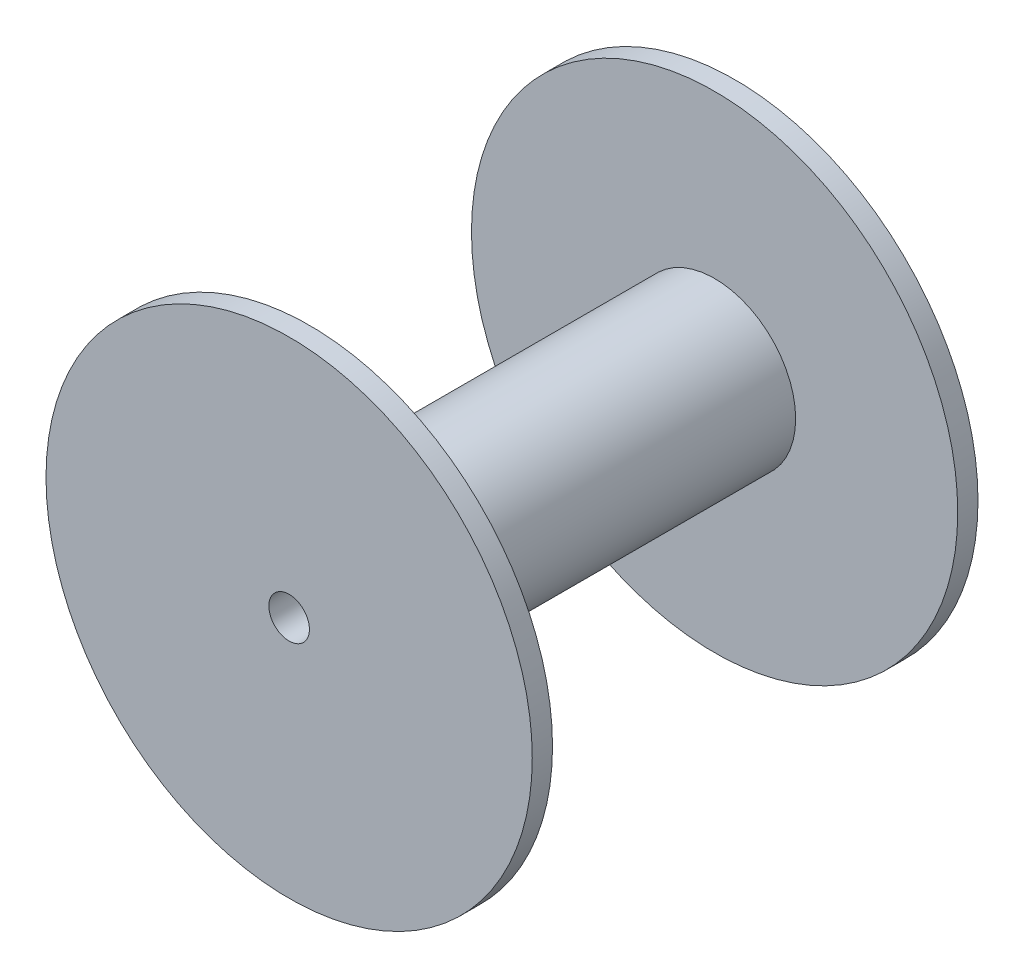
ISO-10303-21;
HEADER;
FILE_DESCRIPTION(('STEP AP214'),'2;1');
FILE_NAME('part.step','',(''),(''),'','','');
FILE_SCHEMA(('AUTOMOTIVE_DESIGN { 1 0 10303 214 1 1 1 1 }'));
ENDSEC;
DATA;
#1=APPLICATION_CONTEXT('core data for automotive mechanical design processes');
#2=APPLICATION_PROTOCOL_DEFINITION('international standard','automotive_design',2000,#1);
#3=PRODUCT_CONTEXT('',#1,'mechanical');
#4=PRODUCT('Part','Part','',(#3));
#5=PRODUCT_RELATED_PRODUCT_CATEGORY('part','',(#4));
#6=PRODUCT_DEFINITION_FORMATION('','',#4);
#7=PRODUCT_DEFINITION_CONTEXT('part definition',#1,'design');
#8=PRODUCT_DEFINITION('design','',#6,#7);
#9=PRODUCT_DEFINITION_SHAPE('','',#8);
#10=(LENGTH_UNIT() NAMED_UNIT(*) SI_UNIT(.MILLI.,.METRE.));
#11=(NAMED_UNIT(*) PLANE_ANGLE_UNIT() SI_UNIT($,.RADIAN.));
#12=(NAMED_UNIT(*) SI_UNIT($,.STERADIAN.) SOLID_ANGLE_UNIT());
#13=UNCERTAINTY_MEASURE_WITH_UNIT(LENGTH_MEASURE(1.E-05),#10,'distance_accuracy_value','');
#14=(GEOMETRIC_REPRESENTATION_CONTEXT(3) GLOBAL_UNCERTAINTY_ASSIGNED_CONTEXT((#13)) GLOBAL_UNIT_ASSIGNED_CONTEXT((#10,
#11,#12)) REPRESENTATION_CONTEXT('',''));
#15=CARTESIAN_POINT('',(0.,0.,0.));
#16=DIRECTION('',(0.,0.,1.));
#17=DIRECTION('',(1.,0.,0.));
#18=AXIS2_PLACEMENT_3D('',#15,#16,#17);
#19=CARTESIAN_POINT('',(0.,0.,1000.));
#20=DIRECTION('',(0.,0.,-1.));
#21=DIRECTION('',(-1.,0.,0.));
#22=AXIS2_PLACEMENT_3D('',#19,#20,#21);
#23=CYLINDRICAL_SURFACE('',#22,200.);
#24=CARTESIAN_POINT('',(0.,0.,1000.));
#25=DIRECTION('',(0.,0.,1.));
#26=DIRECTION('',(1.,0.,0.));
#27=AXIS2_PLACEMENT_3D('',#24,#25,#26);
#28=CIRCLE('',#27,200.);
#29=CARTESIAN_POINT('',(200.,0.,1000.));
#30=VERTEX_POINT('',#29);
#31=EDGE_CURVE('E10',#30,#30,#28,.T.);
#32=ORIENTED_EDGE('',*,*,#31,.F.);
#33=EDGE_LOOP('',(#32));
#34=FACE_BOUND('',#33,.T.);
#35=CARTESIAN_POINT('',(0.,0.,0.));
#36=DIRECTION('',(0.,0.,1.));
#37=DIRECTION('',(1.,0.,0.));
#38=AXIS2_PLACEMENT_3D('',#35,#36,#37);
#39=CIRCLE('',#38,200.);
#40=CARTESIAN_POINT('',(200.,0.,0.));
#41=VERTEX_POINT('',#40);
#42=EDGE_CURVE('E39',#41,#41,#39,.T.);
#43=ORIENTED_EDGE('',*,*,#42,.T.);
#44=EDGE_LOOP('',(#43));
#45=FACE_BOUND('',#44,.T.);
#46=ADVANCED_FACE('F36',(#34,#45),#23,.T.);
#47=CARTESIAN_POINT('',(0.,0.,1050.));
#48=DIRECTION('',(0.,0.,-1.));
#49=DIRECTION('',(-1.,0.,0.));
#50=AXIS2_PLACEMENT_3D('',#47,#48,#49);
#51=CYLINDRICAL_SURFACE('',#50,600.);
#52=CARTESIAN_POINT('',(0.,0.,1050.));
#53=DIRECTION('',(0.,0.,1.));
#54=DIRECTION('',(1.,0.,0.));
#55=AXIS2_PLACEMENT_3D('',#52,#53,#54);
#56=CIRCLE('',#55,600.);
#57=CARTESIAN_POINT('',(600.,0.,1050.));
#58=VERTEX_POINT('',#57);
#59=EDGE_CURVE('E44',#58,#58,#56,.T.);
#60=ORIENTED_EDGE('',*,*,#59,.F.);
#61=EDGE_LOOP('',(#60));
#62=FACE_BOUND('',#61,.T.);
#63=CARTESIAN_POINT('',(0.,0.,1000.));
#64=DIRECTION('',(0.,0.,1.));
#65=DIRECTION('',(1.,0.,0.));
#66=AXIS2_PLACEMENT_3D('',#63,#64,#65);
#67=CIRCLE('',#66,600.);
#68=CARTESIAN_POINT('',(600.,0.,1000.));
#69=VERTEX_POINT('',#68);
#70=EDGE_CURVE('E49',#69,#69,#67,.T.);
#71=ORIENTED_EDGE('',*,*,#70,.T.);
#72=EDGE_LOOP('',(#71));
#73=FACE_BOUND('',#72,.T.);
#74=ADVANCED_FACE('F86',(#62,#73),#51,.T.);
#75=CARTESIAN_POINT('',(0.,0.,1050.));
#76=DIRECTION('',(0.,0.,1.));
#77=DIRECTION('',(1.,0.,0.));
#78=AXIS2_PLACEMENT_3D('',#75,#76,#77);
#79=PLANE('',#78);
#80=CARTESIAN_POINT('',(0.,0.,1050.));
#81=DIRECTION('',(0.,0.,1.));
#82=DIRECTION('',(1.,0.,0.));
#83=AXIS2_PLACEMENT_3D('',#80,#81,#82);
#84=CIRCLE('',#83,50.);
#85=CARTESIAN_POINT('',(50.,0.,1050.));
#86=VERTEX_POINT('',#85);
#87=EDGE_CURVE('E64',#86,#86,#84,.T.);
#88=ORIENTED_EDGE('',*,*,#87,.F.);
#89=EDGE_LOOP('',(#88));
#90=FACE_BOUND('',#89,.T.);
#91=ORIENTED_EDGE('',*,*,#59,.T.);
#92=EDGE_LOOP('',(#91));
#93=FACE_BOUND('',#92,.T.);
#94=ADVANCED_FACE('F82',(#90,#93),#79,.T.);
#95=CARTESIAN_POINT('',(0.,0.,1000.));
#96=DIRECTION('',(0.,0.,1.));
#97=DIRECTION('',(1.,0.,0.));
#98=AXIS2_PLACEMENT_3D('',#95,#96,#97);
#99=PLANE('',#98);
#100=ORIENTED_EDGE('',*,*,#31,.T.);
#101=EDGE_LOOP('',(#100));
#102=FACE_BOUND('',#101,.T.);
#103=ORIENTED_EDGE('',*,*,#70,.F.);
#104=EDGE_LOOP('',(#103));
#105=FACE_BOUND('',#104,.T.);
#106=ADVANCED_FACE('F85',(#102,#105),#99,.F.);
#107=CARTESIAN_POINT('',(0.,0.,-50.));
#108=DIRECTION('',(0.,0.,1.));
#109=DIRECTION('',(1.,0.,0.));
#110=AXIS2_PLACEMENT_3D('',#107,#108,#109);
#111=CYLINDRICAL_SURFACE('',#110,600.);
#112=CARTESIAN_POINT('',(0.,0.,-50.));
#113=DIRECTION('',(0.,0.,-1.));
#114=DIRECTION('',(-1.,0.,0.));
#115=AXIS2_PLACEMENT_3D('',#112,#113,#114);
#116=CIRCLE('',#115,600.);
#117=CARTESIAN_POINT('',(-600.,0.,-50.));
#118=VERTEX_POINT('',#117);
#119=EDGE_CURVE('E59',#118,#118,#116,.T.);
#120=ORIENTED_EDGE('',*,*,#119,.F.);
#121=EDGE_LOOP('',(#120));
#122=FACE_BOUND('',#121,.T.);
#123=CARTESIAN_POINT('',(0.,0.,0.));
#124=DIRECTION('',(0.,0.,-1.));
#125=DIRECTION('',(-1.,0.,0.));
#126=AXIS2_PLACEMENT_3D('',#123,#124,#125);
#127=CIRCLE('',#126,600.);
#128=CARTESIAN_POINT('',(-600.,0.,0.));
#129=VERTEX_POINT('',#128);
#130=EDGE_CURVE('E55',#129,#129,#127,.T.);
#131=ORIENTED_EDGE('',*,*,#130,.T.);
#132=EDGE_LOOP('',(#131));
#133=FACE_BOUND('',#132,.T.);
#134=ADVANCED_FACE('F95',(#122,#133),#111,.T.);
#135=CARTESIAN_POINT('',(0.,0.,-50.));
#136=DIRECTION('',(0.,0.,-1.));
#137=DIRECTION('',(-1.,0.,0.));
#138=AXIS2_PLACEMENT_3D('',#135,#136,#137);
#139=PLANE('',#138);
#140=CARTESIAN_POINT('',(0.,0.,-50.));
#141=DIRECTION('',(0.,0.,1.));
#142=DIRECTION('',(1.,0.,0.));
#143=AXIS2_PLACEMENT_3D('',#140,#141,#142);
#144=CIRCLE('',#143,50.);
#145=CARTESIAN_POINT('',(50.,0.,-50.));
#146=VERTEX_POINT('',#145);
#147=EDGE_CURVE('E60',#146,#146,#144,.T.);
#148=ORIENTED_EDGE('',*,*,#147,.T.);
#149=EDGE_LOOP('',(#148));
#150=FACE_BOUND('',#149,.T.);
#151=ORIENTED_EDGE('',*,*,#119,.T.);
#152=EDGE_LOOP('',(#151));
#153=FACE_BOUND('',#152,.T.);
#154=ADVANCED_FACE('F72',(#150,#153),#139,.T.);
#155=CARTESIAN_POINT('',(0.,0.,0.));
#156=DIRECTION('',(0.,0.,-1.));
#157=DIRECTION('',(-1.,0.,0.));
#158=AXIS2_PLACEMENT_3D('',#155,#156,#157);
#159=PLANE('',#158);
#160=ORIENTED_EDGE('',*,*,#42,.F.);
#161=EDGE_LOOP('',(#160));
#162=FACE_BOUND('',#161,.T.);
#163=ORIENTED_EDGE('',*,*,#130,.F.);
#164=EDGE_LOOP('',(#163));
#165=FACE_BOUND('',#164,.T.);
#166=ADVANCED_FACE('F78',(#162,#165),#159,.F.);
#167=CARTESIAN_POINT('',(0.,0.,-50.));
#168=DIRECTION('',(0.,0.,1.));
#169=DIRECTION('',(1.,0.,0.));
#170=AXIS2_PLACEMENT_3D('',#167,#168,#169);
#171=CYLINDRICAL_SURFACE('',#170,50.);
#172=ORIENTED_EDGE('',*,*,#147,.F.);
#173=EDGE_LOOP('',(#172));
#174=FACE_BOUND('',#173,.T.);
#175=ORIENTED_EDGE('',*,*,#87,.T.);
#176=EDGE_LOOP('',(#175));
#177=FACE_BOUND('',#176,.T.);
#178=ADVANCED_FACE('F75',(#174,#177),#171,.F.);
#179=CLOSED_SHELL('',(#46,#74,#94,#106,#134,#154,#166,#178));
#180=MANIFOLD_SOLID_BREP('B2',#179);
#181=ADVANCED_BREP_SHAPE_REPRESENTATION('',(#18,#180),#14);
#182=SHAPE_DEFINITION_REPRESENTATION(#9,#181);
ENDSEC;
END-ISO-10303-21;
